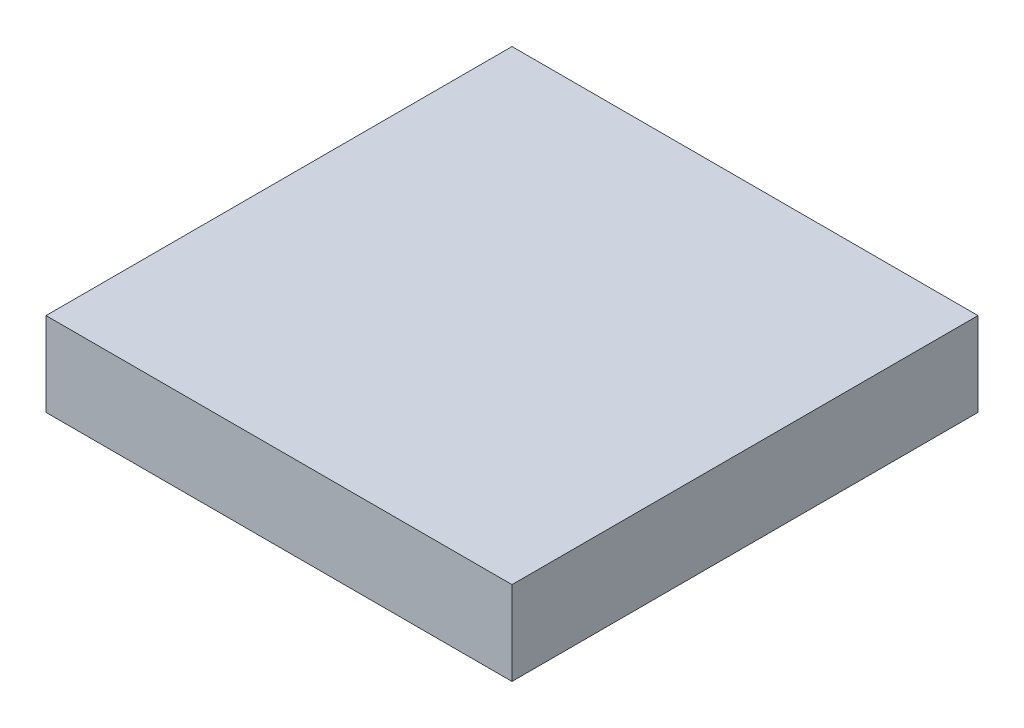
ISO-10303-21;
HEADER;
FILE_DESCRIPTION(('STEP AP214'),'2;1');
FILE_NAME('part.step','',(''),(''),'','','');
FILE_SCHEMA(('AUTOMOTIVE_DESIGN { 1 0 10303 214 1 1 1 1 }'));
ENDSEC;
DATA;
#1=APPLICATION_CONTEXT('core data for automotive mechanical design processes');
#2=APPLICATION_PROTOCOL_DEFINITION('international standard','automotive_design',2000,#1);
#3=PRODUCT_CONTEXT('',#1,'mechanical');
#4=PRODUCT('Part','Part','',(#3));
#5=PRODUCT_RELATED_PRODUCT_CATEGORY('part','',(#4));
#6=PRODUCT_DEFINITION_FORMATION('','',#4);
#7=PRODUCT_DEFINITION_CONTEXT('part definition',#1,'design');
#8=PRODUCT_DEFINITION('design','',#6,#7);
#9=PRODUCT_DEFINITION_SHAPE('','',#8);
#10=(LENGTH_UNIT() NAMED_UNIT(*) SI_UNIT(.MILLI.,.METRE.));
#11=(NAMED_UNIT(*) PLANE_ANGLE_UNIT() SI_UNIT($,.RADIAN.));
#12=(NAMED_UNIT(*) SI_UNIT($,.STERADIAN.) SOLID_ANGLE_UNIT());
#13=UNCERTAINTY_MEASURE_WITH_UNIT(LENGTH_MEASURE(1.E-05),#10,'distance_accuracy_value','');
#14=(GEOMETRIC_REPRESENTATION_CONTEXT(3) GLOBAL_UNCERTAINTY_ASSIGNED_CONTEXT((#13)) GLOBAL_UNIT_ASSIGNED_CONTEXT((#10,
#11,#12)) REPRESENTATION_CONTEXT('',''));
#15=CARTESIAN_POINT('',(0.,0.,0.));
#16=DIRECTION('',(0.,0.,1.));
#17=DIRECTION('',(1.,0.,0.));
#18=AXIS2_PLACEMENT_3D('',#15,#16,#17);
#19=CARTESIAN_POINT('',(5.,1.8,-5.));
#20=DIRECTION('',(-1.,0.,0.));
#21=DIRECTION('',(0.,0.,1.));
#22=AXIS2_PLACEMENT_3D('',#19,#20,#21);
#23=PLANE('',#22);
#24=DIRECTION('',(0.,0.,-1.));
#25=VECTOR('',#24,1.);
#26=CARTESIAN_POINT('',(5.,0.,-5.));
#27=LINE('',#26,#25);
#28=CARTESIAN_POINT('',(5.,0.,5.));
#29=VERTEX_POINT('',#28);
#30=CARTESIAN_POINT('',(5.,0.,-5.));
#31=VERTEX_POINT('',#30);
#32=EDGE_CURVE('E107',#29,#31,#27,.T.);
#33=ORIENTED_EDGE('',*,*,#32,.T.);
#34=DIRECTION('',(0.,-1.,0.));
#35=VECTOR('',#34,1.);
#36=CARTESIAN_POINT('',(5.,1.8,-5.));
#37=LINE('',#36,#35);
#38=CARTESIAN_POINT('',(5.,1.8,-5.));
#39=VERTEX_POINT('',#38);
#40=EDGE_CURVE('E11',#39,#31,#37,.T.);
#41=ORIENTED_EDGE('',*,*,#40,.F.);
#42=DIRECTION('',(0.,0.,-1.));
#43=VECTOR('',#42,1.);
#44=CARTESIAN_POINT('',(5.,1.8,-5.));
#45=LINE('',#44,#43);
#46=CARTESIAN_POINT('',(5.,1.8,5.));
#47=VERTEX_POINT('',#46);
#48=EDGE_CURVE('E91',#47,#39,#45,.T.);
#49=ORIENTED_EDGE('',*,*,#48,.F.);
#50=DIRECTION('',(0.,-1.,0.));
#51=VECTOR('',#50,1.);
#52=CARTESIAN_POINT('',(5.,1.8,5.));
#53=LINE('',#52,#51);
#54=EDGE_CURVE('E103',#47,#29,#53,.T.);
#55=ORIENTED_EDGE('',*,*,#54,.T.);
#56=EDGE_LOOP('',(#33,#41,#49,#55));
#57=FACE_BOUND('',#56,.T.);
#58=ADVANCED_FACE('F39',(#57),#23,.F.);
#59=CARTESIAN_POINT('',(-5.,1.8,-5.));
#60=DIRECTION('',(0.,0.,1.));
#61=DIRECTION('',(1.,0.,0.));
#62=AXIS2_PLACEMENT_3D('',#59,#60,#61);
#63=PLANE('',#62);
#64=DIRECTION('',(-1.,0.,0.));
#65=VECTOR('',#64,1.);
#66=CARTESIAN_POINT('',(-5.,0.,-5.));
#67=LINE('',#66,#65);
#68=CARTESIAN_POINT('',(-5.,0.,-5.));
#69=VERTEX_POINT('',#68);
#70=EDGE_CURVE('E96',#31,#69,#67,.T.);
#71=ORIENTED_EDGE('',*,*,#70,.T.);
#72=DIRECTION('',(0.,-1.,0.));
#73=VECTOR('',#72,1.);
#74=CARTESIAN_POINT('',(-5.,1.8,-5.));
#75=LINE('',#74,#73);
#76=CARTESIAN_POINT('',(-5.,1.8,-5.));
#77=VERTEX_POINT('',#76);
#78=EDGE_CURVE('E48',#77,#69,#75,.T.);
#79=ORIENTED_EDGE('',*,*,#78,.F.);
#80=DIRECTION('',(-1.,0.,0.));
#81=VECTOR('',#80,1.);
#82=CARTESIAN_POINT('',(-5.,1.8,-5.));
#83=LINE('',#82,#81);
#84=EDGE_CURVE('E86',#39,#77,#83,.T.);
#85=ORIENTED_EDGE('',*,*,#84,.F.);
#86=ORIENTED_EDGE('',*,*,#40,.T.);
#87=EDGE_LOOP('',(#71,#79,#85,#86));
#88=FACE_BOUND('',#87,.T.);
#89=ADVANCED_FACE('F95',(#88),#63,.F.);
#90=CARTESIAN_POINT('',(-5.,1.8,-5.));
#91=DIRECTION('',(1.,0.,0.));
#92=DIRECTION('',(0.,0.,-1.));
#93=AXIS2_PLACEMENT_3D('',#90,#91,#92);
#94=PLANE('',#93);
#95=DIRECTION('',(0.,0.,1.));
#96=VECTOR('',#95,1.);
#97=CARTESIAN_POINT('',(-5.,0.,-5.));
#98=LINE('',#97,#96);
#99=CARTESIAN_POINT('',(-5.,0.,5.));
#100=VERTEX_POINT('',#99);
#101=EDGE_CURVE('E73',#69,#100,#98,.T.);
#102=ORIENTED_EDGE('',*,*,#101,.T.);
#103=DIRECTION('',(0.,-1.,0.));
#104=VECTOR('',#103,1.);
#105=CARTESIAN_POINT('',(-5.,1.8,5.));
#106=LINE('',#105,#104);
#107=CARTESIAN_POINT('',(-5.,1.8,5.));
#108=VERTEX_POINT('',#107);
#109=EDGE_CURVE('E98',#108,#100,#106,.T.);
#110=ORIENTED_EDGE('',*,*,#109,.F.);
#111=DIRECTION('',(0.,0.,1.));
#112=VECTOR('',#111,1.);
#113=CARTESIAN_POINT('',(-5.,1.8,-5.));
#114=LINE('',#113,#112);
#115=EDGE_CURVE('E89',#77,#108,#114,.T.);
#116=ORIENTED_EDGE('',*,*,#115,.F.);
#117=ORIENTED_EDGE('',*,*,#78,.T.);
#118=EDGE_LOOP('',(#102,#110,#116,#117));
#119=FACE_BOUND('',#118,.T.);
#120=ADVANCED_FACE('F99',(#119),#94,.F.);
#121=CARTESIAN_POINT('',(-5.,1.8,5.));
#122=DIRECTION('',(0.,0.,-1.));
#123=DIRECTION('',(-1.,0.,0.));
#124=AXIS2_PLACEMENT_3D('',#121,#122,#123);
#125=PLANE('',#124);
#126=DIRECTION('',(1.,0.,0.));
#127=VECTOR('',#126,1.);
#128=CARTESIAN_POINT('',(-5.,0.,5.));
#129=LINE('',#128,#127);
#130=EDGE_CURVE('E79',#100,#29,#129,.T.);
#131=ORIENTED_EDGE('',*,*,#130,.T.);
#132=ORIENTED_EDGE('',*,*,#54,.F.);
#133=DIRECTION('',(1.,0.,0.));
#134=VECTOR('',#133,1.);
#135=CARTESIAN_POINT('',(-5.,1.8,5.));
#136=LINE('',#135,#134);
#137=EDGE_CURVE('E56',#108,#47,#136,.T.);
#138=ORIENTED_EDGE('',*,*,#137,.F.);
#139=ORIENTED_EDGE('',*,*,#109,.T.);
#140=EDGE_LOOP('',(#131,#132,#138,#139));
#141=FACE_BOUND('',#140,.T.);
#142=ADVANCED_FACE('F120',(#141),#125,.F.);
#143=CARTESIAN_POINT('',(0.,1.8,0.));
#144=DIRECTION('',(0.,1.,0.));
#145=DIRECTION('',(0.,0.,1.));
#146=AXIS2_PLACEMENT_3D('',#143,#144,#145);
#147=PLANE('',#146);
#148=ORIENTED_EDGE('',*,*,#48,.T.);
#149=ORIENTED_EDGE('',*,*,#84,.T.);
#150=ORIENTED_EDGE('',*,*,#115,.T.);
#151=ORIENTED_EDGE('',*,*,#137,.T.);
#152=EDGE_LOOP('',(#148,#149,#150,#151));
#153=FACE_BOUND('',#152,.T.);
#154=ADVANCED_FACE('F87',(#153),#147,.T.);
#155=CARTESIAN_POINT('',(0.,0.,0.));
#156=DIRECTION('',(0.,1.,0.));
#157=DIRECTION('',(0.,0.,1.));
#158=AXIS2_PLACEMENT_3D('',#155,#156,#157);
#159=PLANE('',#158);
#160=ORIENTED_EDGE('',*,*,#32,.F.);
#161=ORIENTED_EDGE('',*,*,#130,.F.);
#162=ORIENTED_EDGE('',*,*,#101,.F.);
#163=ORIENTED_EDGE('',*,*,#70,.F.);
#164=EDGE_LOOP('',(#160,#161,#162,#163));
#165=FACE_BOUND('',#164,.T.);
#166=ADVANCED_FACE('F123',(#165),#159,.F.);
#167=CLOSED_SHELL('',(#58,#89,#120,#142,#154,#166));
#168=MANIFOLD_SOLID_BREP('B2',#167);
#169=ADVANCED_BREP_SHAPE_REPRESENTATION('',(#18,#168),#14);
#170=SHAPE_DEFINITION_REPRESENTATION(#9,#169);
ENDSEC;
END-ISO-10303-21;
